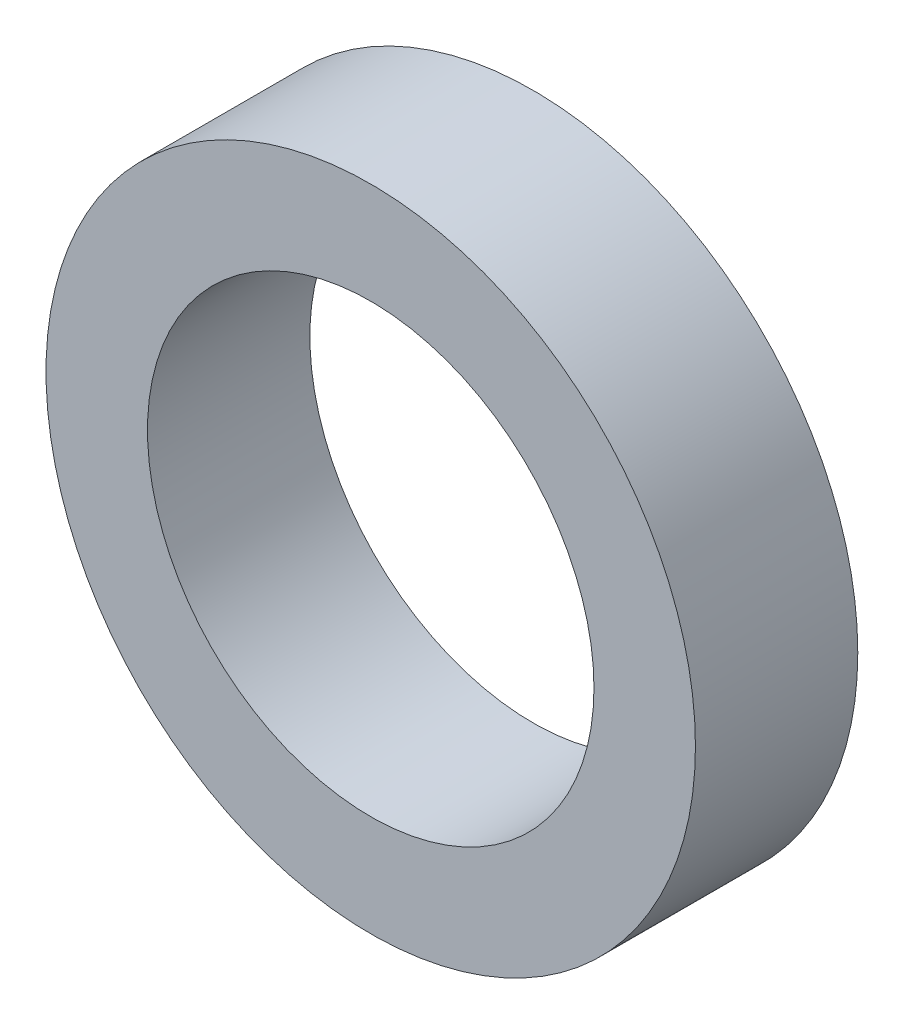
ISO-10303-21;
HEADER;
FILE_DESCRIPTION(('STEP AP214'),'2;1');
FILE_NAME('part.step','',(''),(''),'','','');
FILE_SCHEMA(('AUTOMOTIVE_DESIGN { 1 0 10303 214 1 1 1 1 }'));
ENDSEC;
DATA;
#1=APPLICATION_CONTEXT('core data for automotive mechanical design processes');
#2=APPLICATION_PROTOCOL_DEFINITION('international standard','automotive_design',2000,#1);
#3=PRODUCT_CONTEXT('',#1,'mechanical');
#4=PRODUCT('Part','Part','',(#3));
#5=PRODUCT_RELATED_PRODUCT_CATEGORY('part','',(#4));
#6=PRODUCT_DEFINITION_FORMATION('','',#4);
#7=PRODUCT_DEFINITION_CONTEXT('part definition',#1,'design');
#8=PRODUCT_DEFINITION('design','',#6,#7);
#9=PRODUCT_DEFINITION_SHAPE('','',#8);
#10=(LENGTH_UNIT() NAMED_UNIT(*) SI_UNIT(.MILLI.,.METRE.));
#11=(NAMED_UNIT(*) PLANE_ANGLE_UNIT() SI_UNIT($,.RADIAN.));
#12=(NAMED_UNIT(*) SI_UNIT($,.STERADIAN.) SOLID_ANGLE_UNIT());
#13=UNCERTAINTY_MEASURE_WITH_UNIT(LENGTH_MEASURE(1.E-05),#10,'distance_accuracy_value','');
#14=(GEOMETRIC_REPRESENTATION_CONTEXT(3) GLOBAL_UNCERTAINTY_ASSIGNED_CONTEXT((#13)) GLOBAL_UNIT_ASSIGNED_CONTEXT((#10,
#11,#12)) REPRESENTATION_CONTEXT('',''));
#15=CARTESIAN_POINT('',(0.,0.,0.));
#16=DIRECTION('',(0.,0.,1.));
#17=DIRECTION('',(1.,0.,0.));
#18=AXIS2_PLACEMENT_3D('',#15,#16,#17);
#19=CARTESIAN_POINT('',(0.,0.,2.));
#20=DIRECTION('',(0.,0.,-1.));
#21=DIRECTION('',(-1.,0.,0.));
#22=AXIS2_PLACEMENT_3D('',#19,#20,#21);
#23=CYLINDRICAL_SURFACE('',#22,4.);
#24=CARTESIAN_POINT('',(0.,0.,2.));
#25=DIRECTION('',(0.,0.,1.));
#26=DIRECTION('',(1.,0.,0.));
#27=AXIS2_PLACEMENT_3D('',#24,#25,#26);
#28=CIRCLE('',#27,4.);
#29=CARTESIAN_POINT('',(4.,0.,2.));
#30=VERTEX_POINT('',#29);
#31=EDGE_CURVE('E10',#30,#30,#28,.T.);
#32=ORIENTED_EDGE('',*,*,#31,.F.);
#33=EDGE_LOOP('',(#32));
#34=FACE_BOUND('',#33,.T.);
#35=CARTESIAN_POINT('',(0.,0.,0.));
#36=DIRECTION('',(0.,0.,1.));
#37=DIRECTION('',(1.,0.,0.));
#38=AXIS2_PLACEMENT_3D('',#35,#36,#37);
#39=CIRCLE('',#38,4.);
#40=CARTESIAN_POINT('',(4.,0.,0.));
#41=VERTEX_POINT('',#40);
#42=EDGE_CURVE('E37',#41,#41,#39,.T.);
#43=ORIENTED_EDGE('',*,*,#42,.T.);
#44=EDGE_LOOP('',(#43));
#45=FACE_BOUND('',#44,.T.);
#46=ADVANCED_FACE('F40',(#34,#45),#23,.T.);
#47=CARTESIAN_POINT('',(0.,0.,2.));
#48=DIRECTION('',(0.,0.,1.));
#49=DIRECTION('',(1.,0.,0.));
#50=AXIS2_PLACEMENT_3D('',#47,#48,#49);
#51=PLANE('',#50);
#52=CARTESIAN_POINT('',(0.,0.,2.));
#53=DIRECTION('',(0.,0.,1.));
#54=DIRECTION('',(1.,0.,0.));
#55=AXIS2_PLACEMENT_3D('',#52,#53,#54);
#56=CIRCLE('',#55,2.75);
#57=CARTESIAN_POINT('',(2.75,0.,2.));
#58=VERTEX_POINT('',#57);
#59=EDGE_CURVE('E47',#58,#58,#56,.T.);
#60=ORIENTED_EDGE('',*,*,#59,.F.);
#61=EDGE_LOOP('',(#60));
#62=FACE_BOUND('',#61,.T.);
#63=ORIENTED_EDGE('',*,*,#31,.T.);
#64=EDGE_LOOP('',(#63));
#65=FACE_BOUND('',#64,.T.);
#66=ADVANCED_FACE('F61',(#62,#65),#51,.T.);
#67=CARTESIAN_POINT('',(0.,0.,0.));
#68=DIRECTION('',(0.,0.,1.));
#69=DIRECTION('',(1.,0.,0.));
#70=AXIS2_PLACEMENT_3D('',#67,#68,#69);
#71=PLANE('',#70);
#72=CARTESIAN_POINT('',(0.,0.,0.));
#73=DIRECTION('',(0.,0.,1.));
#74=DIRECTION('',(1.,0.,0.));
#75=AXIS2_PLACEMENT_3D('',#72,#73,#74);
#76=CIRCLE('',#75,2.75);
#77=CARTESIAN_POINT('',(2.75,0.,0.));
#78=VERTEX_POINT('',#77);
#79=EDGE_CURVE('E50',#78,#78,#76,.T.);
#80=ORIENTED_EDGE('',*,*,#79,.T.);
#81=EDGE_LOOP('',(#80));
#82=FACE_BOUND('',#81,.T.);
#83=ORIENTED_EDGE('',*,*,#42,.F.);
#84=EDGE_LOOP('',(#83));
#85=FACE_BOUND('',#84,.T.);
#86=ADVANCED_FACE('F54',(#82,#85),#71,.F.);
#87=CARTESIAN_POINT('',(0.,0.,0.));
#88=DIRECTION('',(0.,0.,1.));
#89=DIRECTION('',(1.,0.,0.));
#90=AXIS2_PLACEMENT_3D('',#87,#88,#89);
#91=CYLINDRICAL_SURFACE('',#90,2.75);
#92=ORIENTED_EDGE('',*,*,#79,.F.);
#93=EDGE_LOOP('',(#92));
#94=FACE_BOUND('',#93,.T.);
#95=ORIENTED_EDGE('',*,*,#59,.T.);
#96=EDGE_LOOP('',(#95));
#97=FACE_BOUND('',#96,.T.);
#98=ADVANCED_FACE('F59',(#94,#97),#91,.F.);
#99=CLOSED_SHELL('',(#46,#66,#86,#98));
#100=MANIFOLD_SOLID_BREP('B2',#99);
#101=ADVANCED_BREP_SHAPE_REPRESENTATION('',(#18,#100),#14);
#102=SHAPE_DEFINITION_REPRESENTATION(#9,#101);
ENDSEC;
END-ISO-10303-21;
